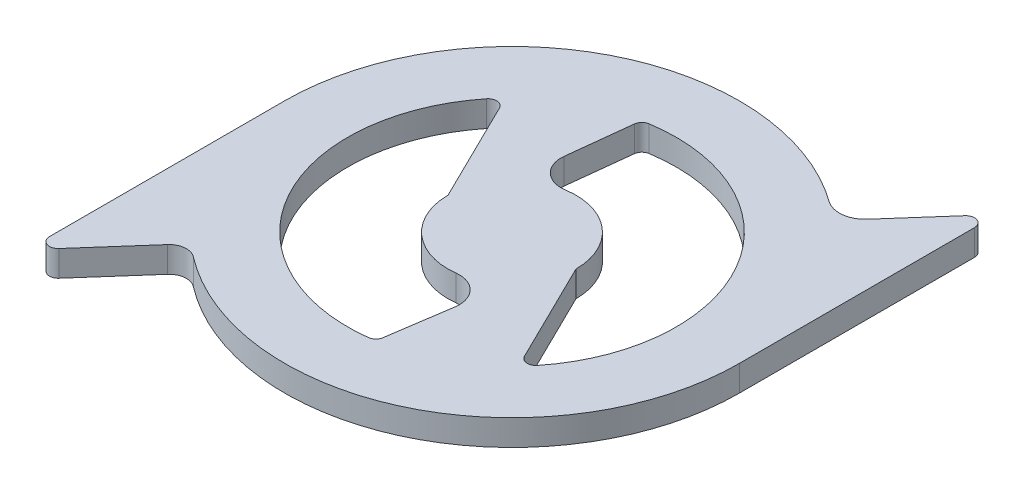
ISO-10303-21;
HEADER;
FILE_DESCRIPTION(('STEP AP214'),'2;1');
FILE_NAME('part.step','',(''),(''),'','','');
FILE_SCHEMA(('AUTOMOTIVE_DESIGN { 1 0 10303 214 1 1 1 1 }'));
ENDSEC;
DATA;
#1=APPLICATION_CONTEXT('core data for automotive mechanical design processes');
#2=APPLICATION_PROTOCOL_DEFINITION('international standard','automotive_design',2000,#1);
#3=PRODUCT_CONTEXT('',#1,'mechanical');
#4=PRODUCT('Part','Part','',(#3));
#5=PRODUCT_RELATED_PRODUCT_CATEGORY('part','',(#4));
#6=PRODUCT_DEFINITION_FORMATION('','',#4);
#7=PRODUCT_DEFINITION_CONTEXT('part definition',#1,'design');
#8=PRODUCT_DEFINITION('design','',#6,#7);
#9=PRODUCT_DEFINITION_SHAPE('','',#8);
#10=(LENGTH_UNIT() NAMED_UNIT(*) SI_UNIT(.MILLI.,.METRE.));
#11=(NAMED_UNIT(*) PLANE_ANGLE_UNIT() SI_UNIT($,.RADIAN.));
#12=(NAMED_UNIT(*) SI_UNIT($,.STERADIAN.) SOLID_ANGLE_UNIT());
#13=UNCERTAINTY_MEASURE_WITH_UNIT(LENGTH_MEASURE(1.E-05),#10,'distance_accuracy_value','');
#14=(GEOMETRIC_REPRESENTATION_CONTEXT(3) GLOBAL_UNCERTAINTY_ASSIGNED_CONTEXT((#13)) GLOBAL_UNIT_ASSIGNED_CONTEXT((#10,
#11,#12)) REPRESENTATION_CONTEXT('',''));
#15=CARTESIAN_POINT('',(0.,0.,0.));
#16=DIRECTION('',(0.,0.,1.));
#17=DIRECTION('',(1.,0.,0.));
#18=AXIS2_PLACEMENT_3D('',#15,#16,#17);
#19=CARTESIAN_POINT('',(0.,3.,0.));
#20=DIRECTION('',(0.,1.,0.));
#21=DIRECTION('',(0.,0.,1.));
#22=AXIS2_PLACEMENT_3D('',#19,#20,#21);
#23=PLANE('',#22);
#24=DIRECTION('',(0.,0.,1.));
#25=VECTOR('',#24,1.);
#26=CARTESIAN_POINT('',(-26.4575131106459,3.,0.));
#27=LINE('',#26,#25);
#28=CARTESIAN_POINT('',(-26.4575131106459,3.,0.));
#29=VERTEX_POINT('',#28);
#30=CARTESIAN_POINT('',(-26.4575131106459,3.,27.3542486889354));
#31=VERTEX_POINT('',#30);
#32=EDGE_CURVE('E288',#29,#31,#27,.T.);
#33=ORIENTED_EDGE('',*,*,#32,.T.);
#34=CARTESIAN_POINT('',(-25.4575131106459,3.,27.3542486889354));
#35=DIRECTION('',(0.,1.,0.));
#36=DIRECTION('',(0.,0.,1.));
#37=AXIS2_PLACEMENT_3D('',#34,#35,#36);
#38=CIRCLE('',#37,1.);
#39=CARTESIAN_POINT('',(-24.7075131106459,3.,28.0156865167016));
#40=VERTEX_POINT('',#39);
#41=EDGE_CURVE('E337',#31,#40,#38,.T.);
#42=ORIENTED_EDGE('',*,*,#41,.T.);
#43=DIRECTION('',(0.661437827766148,0.,-0.75));
#44=VECTOR('',#43,1.);
#45=CARTESIAN_POINT('',(-26.4575131106459,3.,30.));
#46=LINE('',#45,#44);
#47=CARTESIAN_POINT('',(-18.77633212168,3.,21.290359426251));
#48=VERTEX_POINT('',#47);
#49=EDGE_CURVE('E292',#40,#48,#46,.T.);
#50=ORIENTED_EDGE('',*,*,#49,.T.);
#51=CARTESIAN_POINT('',(-17.27633212168,3.,22.6132350817833));
#52=DIRECTION('',(0.,1.,0.));
#53=DIRECTION('',(0.,0.,1.));
#54=AXIS2_PLACEMENT_3D('',#51,#52,#53);
#55=CIRCLE('',#54,2.);
#56=CARTESIAN_POINT('',(-16.0621478706171,3.,21.0239721694648));
#57=VERTEX_POINT('',#56);
#58=EDGE_CURVE('E366',#48,#57,#55,.F.);
#59=ORIENTED_EDGE('',*,*,#58,.T.);
#60=CARTESIAN_POINT('',(0.,3.,0.));
#61=DIRECTION('',(0.,1.,0.));
#62=DIRECTION('',(0.,0.,1.));
#63=AXIS2_PLACEMENT_3D('',#60,#61,#62);
#64=CIRCLE('',#63,26.4575131106459);
#65=CARTESIAN_POINT('',(26.4575131106459,3.,0.));
#66=VERTEX_POINT('',#65);
#67=EDGE_CURVE('E295',#57,#66,#64,.T.);
#68=ORIENTED_EDGE('',*,*,#67,.T.);
#69=DIRECTION('',(0.,0.,-1.));
#70=VECTOR('',#69,1.);
#71=CARTESIAN_POINT('',(26.4575131106459,3.,0.));
#72=LINE('',#71,#70);
#73=CARTESIAN_POINT('',(26.4575131106459,3.,-27.3542486889354));
#74=VERTEX_POINT('',#73);
#75=EDGE_CURVE('E297',#66,#74,#72,.T.);
#76=ORIENTED_EDGE('',*,*,#75,.T.);
#77=CARTESIAN_POINT('',(25.4575131106459,3.,-27.3542486889354));
#78=DIRECTION('',(0.,1.,0.));
#79=DIRECTION('',(0.,0.,1.));
#80=AXIS2_PLACEMENT_3D('',#77,#78,#79);
#81=CIRCLE('',#80,1.);
#82=CARTESIAN_POINT('',(24.7075131106459,3.,-28.0156865167016));
#83=VERTEX_POINT('',#82);
#84=EDGE_CURVE('E328',#74,#83,#81,.T.);
#85=ORIENTED_EDGE('',*,*,#84,.T.);
#86=DIRECTION('',(-0.661437827766148,0.,0.75));
#87=VECTOR('',#86,1.);
#88=CARTESIAN_POINT('',(26.4575131106459,3.,-30.));
#89=LINE('',#88,#87);
#90=CARTESIAN_POINT('',(19.383007298029,3.,-21.9782644162006));
#91=VERTEX_POINT('',#90);
#92=EDGE_CURVE('E300',#83,#91,#89,.T.);
#93=ORIENTED_EDGE('',*,*,#92,.T.);
#94=CARTESIAN_POINT('',(17.133007298029,3.,-23.962577899499));
#95=DIRECTION('',(0.,1.,0.));
#96=DIRECTION('',(0.,0.,1.));
#97=AXIS2_PLACEMENT_3D('',#94,#95,#96);
#98=CIRCLE('',#97,3.);
#99=CARTESIAN_POINT('',(15.3881545773996,3.,-21.522190843454));
#100=VERTEX_POINT('',#99);
#101=EDGE_CURVE('E11',#91,#100,#98,.F.);
#102=ORIENTED_EDGE('',*,*,#101,.T.);
#103=CARTESIAN_POINT('',(0.,3.,0.));
#104=DIRECTION('',(0.,1.,0.));
#105=DIRECTION('',(0.,0.,1.));
#106=AXIS2_PLACEMENT_3D('',#103,#104,#105);
#107=CIRCLE('',#106,26.4575131106459);
#108=EDGE_CURVE('E286',#100,#29,#107,.T.);
#109=ORIENTED_EDGE('',*,*,#108,.T.);
#110=EDGE_LOOP('',(#33,#42,#50,#59,#68,#76,#85,#93,#102,#109));
#111=FACE_BOUND('',#110,.T.);
#112=CARTESIAN_POINT('',(0.,3.,0.));
#113=DIRECTION('',(0.,-1.,0.));
#114=DIRECTION('',(0.,0.,1.));
#115=AXIS2_PLACEMENT_3D('',#112,#113,#114);
#116=CIRCLE('',#115,7.44339290819635);
#117=CARTESIAN_POINT('',(-1.1563539827482,3.,-7.35302274254406));
#118=VERTEX_POINT('',#117);
#119=CARTESIAN_POINT('',(7.44339290819635,3.,0.));
#120=VERTEX_POINT('',#119);
#121=EDGE_CURVE('E249',#118,#120,#116,.T.);
#122=ORIENTED_EDGE('',*,*,#121,.F.);
#123=CARTESIAN_POINT('',(-1.62241321017722,3.,-10.3165997698083));
#124=DIRECTION('',(0.,1.,0.));
#125=DIRECTION('',(0.,0.,1.));
#126=AXIS2_PLACEMENT_3D('',#123,#124,#125);
#127=CIRCLE('',#126,3.);
#128=CARTESIAN_POINT('',(-4.60372633103575,3.,-10.6509230794903));
#129=VERTEX_POINT('',#128);
#130=EDGE_CURVE('E346',#118,#129,#127,.F.);
#131=ORIENTED_EDGE('',*,*,#130,.T.);
#132=CARTESIAN_POINT('',(-3.694798691627,3.,-18.7562445416921));
#133=CARTESIAN_POINT('',(-5.20099281668894,3.,-5.32482597899103));
#134=B_SPLINE_CURVE_WITH_KNOTS('',1,(#132,#133),.UNSPECIFIED.,.F.,.F.,(2,2),(0.,1.),.UNSPECIFIED.);
#135=CARTESIAN_POINT('',(-3.77815767201383,3.,-18.0128945724512));
#136=VERTEX_POINT('',#135);
#137=EDGE_CURVE('E245',#136,#129,#134,.T.);
#138=ORIENTED_EDGE('',*,*,#137,.F.);
#139=CARTESIAN_POINT('',(-2.78438663172765,3.,-17.9014534692239));
#140=DIRECTION('',(0.,1.,0.));
#141=DIRECTION('',(0.,0.,1.));
#142=AXIS2_PLACEMENT_3D('',#139,#140,#141);
#143=CIRCLE('',#142,1.);
#144=CARTESIAN_POINT('',(-2.93807833717175,3.,-18.8895723181877));
#145=VERTEX_POINT('',#144);
#146=EDGE_CURVE('E356',#136,#145,#143,.F.);
#147=ORIENTED_EDGE('',*,*,#146,.T.);
#148=CARTESIAN_POINT('',(0.,3.,0.));
#149=DIRECTION('',(0.,1.,0.));
#150=DIRECTION('',(0.,0.,1.));
#151=AXIS2_PLACEMENT_3D('',#148,#149,#150);
#152=CIRCLE('',#151,19.1167007268358);
#153=CARTESIAN_POINT('',(14.9092041179956,3.,11.9651109166337));
#154=VERTEX_POINT('',#153);
#155=EDGE_CURVE('E260',#154,#145,#152,.T.);
#156=ORIENTED_EDGE('',*,*,#155,.F.);
#157=CARTESIAN_POINT('',(14.1292994508128,3.,11.3392125941351));
#158=DIRECTION('',(0.,1.,0.));
#159=DIRECTION('',(0.,0.,1.));
#160=AXIS2_PLACEMENT_3D('',#157,#158,#159);
#161=CIRCLE('',#160,1.);
#162=CARTESIAN_POINT('',(13.2317942245481,3.,11.780216413651));
#163=VERTEX_POINT('',#162);
#164=EDGE_CURVE('E393',#154,#163,#161,.F.);
#165=ORIENTED_EDGE('',*,*,#164,.T.);
#166=CARTESIAN_POINT('',(7.44339290819635,3.,0.));
#167=CARTESIAN_POINT('',(13.8947790575231,3.,13.129484438546));
#168=B_SPLINE_CURVE_WITH_KNOTS('',1,(#166,#167),.UNSPECIFIED.,.F.,.F.,(2,2),(0.,1.),.UNSPECIFIED.);
#169=EDGE_CURVE('E255',#120,#163,#168,.T.);
#170=ORIENTED_EDGE('',*,*,#169,.F.);
#171=EDGE_LOOP('',(#122,#131,#138,#147,#156,#165,#170));
#172=FACE_BOUND('',#171,.T.);
#173=CARTESIAN_POINT('',(0.,3.,0.));
#174=DIRECTION('',(0.,1.,0.));
#175=DIRECTION('',(0.,0.,1.));
#176=AXIS2_PLACEMENT_3D('',#173,#174,#175);
#177=CIRCLE('',#176,19.1167007268358);
#178=CARTESIAN_POINT('',(-14.9092041179956,3.,-11.9651109166337));
#179=VERTEX_POINT('',#178);
#180=CARTESIAN_POINT('',(2.26919737076602,3.,18.9815434033145));
#181=VERTEX_POINT('',#180);
#182=EDGE_CURVE('E223',#179,#181,#177,.T.);
#183=ORIENTED_EDGE('',*,*,#182,.F.);
#184=CARTESIAN_POINT('',(-14.1292994508128,3.,-11.3392125941351));
#185=DIRECTION('',(0.,1.,0.));
#186=DIRECTION('',(0.,0.,1.));
#187=AXIS2_PLACEMENT_3D('',#184,#185,#186);
#188=CIRCLE('',#187,1.);
#189=CARTESIAN_POINT('',(-13.2317942245481,3.,-11.780216413651));
#190=VERTEX_POINT('',#189);
#191=EDGE_CURVE('E222',#179,#190,#188,.F.);
#192=ORIENTED_EDGE('',*,*,#191,.T.);
#193=CARTESIAN_POINT('',(-7.44339290819635,3.,0.));
#194=CARTESIAN_POINT('',(-13.8947790575231,3.,-13.129484438546));
#195=B_SPLINE_CURVE_WITH_KNOTS('',1,(#193,#194),.UNSPECIFIED.,.F.,.F.,(2,2),(0.,1.),.UNSPECIFIED.);
#196=CARTESIAN_POINT('',(-7.44339290819635,3.,0.));
#197=VERTEX_POINT('',#196);
#198=EDGE_CURVE('E214',#197,#190,#195,.T.);
#199=ORIENTED_EDGE('',*,*,#198,.F.);
#200=CARTESIAN_POINT('',(0.,3.,0.));
#201=DIRECTION('',(0.,-1.,0.));
#202=DIRECTION('',(0.,0.,1.));
#203=AXIS2_PLACEMENT_3D('',#200,#201,#202);
#204=CIRCLE('',#203,7.44339290819635);
#205=CARTESIAN_POINT('',(0.895975075734543,3.,7.38927104993789));
#206=VERTEX_POINT('',#205);
#207=EDGE_CURVE('E196',#206,#197,#204,.T.);
#208=ORIENTED_EDGE('',*,*,#207,.F.);
#209=CARTESIAN_POINT('',(1.25709066648131,3.,10.3674576676836));
#210=DIRECTION('',(0.,1.,0.));
#211=DIRECTION('',(0.,0.,1.));
#212=AXIS2_PLACEMENT_3D('',#209,#210,#211);
#213=CIRCLE('',#212,3.);
#214=CARTESIAN_POINT('',(4.22473836412304,3.,10.806851730777));
#215=VERTEX_POINT('',#214);
#216=EDGE_CURVE('E374',#206,#215,#213,.F.);
#217=ORIENTED_EDGE('',*,*,#216,.T.);
#218=DIRECTION('',(0.146464687697816,0.,-0.989215899213908));
#219=VECTOR('',#218,1.);
#220=CARTESIAN_POINT('',(5.00971308853062,3.,5.50516782272737));
#221=LINE('',#220,#219);
#222=CARTESIAN_POINT('',(3.13971091630545,3.,18.1350782086781));
#223=VERTEX_POINT('',#222);
#224=EDGE_CURVE('E207',#223,#215,#221,.T.);
#225=ORIENTED_EDGE('',*,*,#224,.F.);
#226=CARTESIAN_POINT('',(2.15049501709154,3.,17.9886135209803));
#227=DIRECTION('',(0.,1.,0.));
#228=DIRECTION('',(0.,0.,1.));
#229=AXIS2_PLACEMENT_3D('',#226,#227,#228);
#230=CIRCLE('',#229,1.);
#231=EDGE_CURVE('E383',#223,#181,#230,.F.);
#232=ORIENTED_EDGE('',*,*,#231,.T.);
#233=EDGE_LOOP('',(#183,#192,#199,#208,#217,#225,#232));
#234=FACE_BOUND('',#233,.T.);
#235=ADVANCED_FACE('F35',(#111,#172,#234),#23,.T.);
#236=CARTESIAN_POINT('',(0.,0.,0.));
#237=DIRECTION('',(0.,1.,0.));
#238=DIRECTION('',(0.,0.,1.));
#239=AXIS2_PLACEMENT_3D('',#236,#237,#238);
#240=PLANE('',#239);
#241=CARTESIAN_POINT('',(7.44339290819635,0.,0.));
#242=CARTESIAN_POINT('',(13.8947790575231,0.,13.129484438546));
#243=B_SPLINE_CURVE_WITH_KNOTS('',1,(#241,#242),.UNSPECIFIED.,.F.,.F.,(2,2),(0.,1.),.UNSPECIFIED.);
#244=CARTESIAN_POINT('',(7.44339290819635,0.,0.));
#245=VERTEX_POINT('',#244);
#246=CARTESIAN_POINT('',(13.2317942245481,0.,11.780216413651));
#247=VERTEX_POINT('',#246);
#248=EDGE_CURVE('E274',#245,#247,#243,.T.);
#249=ORIENTED_EDGE('',*,*,#248,.T.);
#250=CARTESIAN_POINT('',(14.1292994508128,0.,11.3392125941351));
#251=DIRECTION('',(0.,1.,0.));
#252=DIRECTION('',(0.,0.,1.));
#253=AXIS2_PLACEMENT_3D('',#250,#251,#252);
#254=CIRCLE('',#253,1.);
#255=CARTESIAN_POINT('',(14.9092041179956,0.,11.9651109166337));
#256=VERTEX_POINT('',#255);
#257=EDGE_CURVE('E391',#247,#256,#254,.T.);
#258=ORIENTED_EDGE('',*,*,#257,.T.);
#259=CARTESIAN_POINT('',(0.,0.,0.));
#260=DIRECTION('',(0.,1.,0.));
#261=DIRECTION('',(0.,0.,1.));
#262=AXIS2_PLACEMENT_3D('',#259,#260,#261);
#263=CIRCLE('',#262,19.1167007268358);
#264=CARTESIAN_POINT('',(-2.93807833717175,0.,-18.8895723181877));
#265=VERTEX_POINT('',#264);
#266=EDGE_CURVE('E250',#256,#265,#263,.T.);
#267=ORIENTED_EDGE('',*,*,#266,.T.);
#268=CARTESIAN_POINT('',(-2.78438663172765,0.,-17.9014534692239));
#269=DIRECTION('',(0.,1.,0.));
#270=DIRECTION('',(0.,0.,1.));
#271=AXIS2_PLACEMENT_3D('',#268,#269,#270);
#272=CIRCLE('',#271,1.);
#273=CARTESIAN_POINT('',(-3.77815767201383,0.,-18.0128945724512));
#274=VERTEX_POINT('',#273);
#275=EDGE_CURVE('E354',#265,#274,#272,.T.);
#276=ORIENTED_EDGE('',*,*,#275,.T.);
#277=CARTESIAN_POINT('',(-3.694798691627,0.,-18.7562445416921));
#278=CARTESIAN_POINT('',(-5.20099281668894,0.,-5.32482597899103));
#279=B_SPLINE_CURVE_WITH_KNOTS('',1,(#277,#278),.UNSPECIFIED.,.F.,.F.,(2,2),(0.,1.),.UNSPECIFIED.);
#280=CARTESIAN_POINT('',(-4.60372633103575,0.,-10.6509230794903));
#281=VERTEX_POINT('',#280);
#282=EDGE_CURVE('E218',#274,#281,#279,.T.);
#283=ORIENTED_EDGE('',*,*,#282,.T.);
#284=CARTESIAN_POINT('',(-1.62241321017722,0.,-10.3165997698083));
#285=DIRECTION('',(0.,1.,0.));
#286=DIRECTION('',(0.,0.,1.));
#287=AXIS2_PLACEMENT_3D('',#284,#285,#286);
#288=CIRCLE('',#287,3.);
#289=CARTESIAN_POINT('',(-1.1563539827482,0.,-7.35302274254406));
#290=VERTEX_POINT('',#289);
#291=EDGE_CURVE('E344',#281,#290,#288,.T.);
#292=ORIENTED_EDGE('',*,*,#291,.T.);
#293=CARTESIAN_POINT('',(0.,0.,0.));
#294=DIRECTION('',(0.,-1.,0.));
#295=DIRECTION('',(0.,0.,1.));
#296=AXIS2_PLACEMENT_3D('',#293,#294,#295);
#297=CIRCLE('',#296,7.44339290819635);
#298=EDGE_CURVE('E269',#290,#245,#297,.T.);
#299=ORIENTED_EDGE('',*,*,#298,.T.);
#300=EDGE_LOOP('',(#249,#258,#267,#276,#283,#292,#299));
#301=FACE_BOUND('',#300,.T.);
#302=DIRECTION('',(0.661437827766148,0.,-0.75));
#303=VECTOR('',#302,1.);
#304=CARTESIAN_POINT('',(-26.4575131106459,0.,30.));
#305=LINE('',#304,#303);
#306=CARTESIAN_POINT('',(-24.7075131106459,0.,28.0156865167016));
#307=VERTEX_POINT('',#306);
#308=CARTESIAN_POINT('',(-18.77633212168,0.,21.290359426251));
#309=VERTEX_POINT('',#308);
#310=EDGE_CURVE('E307',#307,#309,#305,.T.);
#311=ORIENTED_EDGE('',*,*,#310,.F.);
#312=CARTESIAN_POINT('',(-25.4575131106459,0.,27.3542486889354));
#313=DIRECTION('',(0.,1.,0.));
#314=DIRECTION('',(0.,0.,1.));
#315=AXIS2_PLACEMENT_3D('',#312,#313,#314);
#316=CIRCLE('',#315,1.);
#317=CARTESIAN_POINT('',(-26.4575131106459,0.,27.3542486889354));
#318=VERTEX_POINT('',#317);
#319=EDGE_CURVE('E333',#307,#318,#316,.F.);
#320=ORIENTED_EDGE('',*,*,#319,.T.);
#321=DIRECTION('',(0.,0.,1.));
#322=VECTOR('',#321,1.);
#323=CARTESIAN_POINT('',(-26.4575131106459,0.,0.));
#324=LINE('',#323,#322);
#325=CARTESIAN_POINT('',(-26.4575131106459,0.,0.));
#326=VERTEX_POINT('',#325);
#327=EDGE_CURVE('E304',#326,#318,#324,.T.);
#328=ORIENTED_EDGE('',*,*,#327,.F.);
#329=CARTESIAN_POINT('',(0.,0.,0.));
#330=DIRECTION('',(0.,1.,0.));
#331=DIRECTION('',(0.,0.,1.));
#332=AXIS2_PLACEMENT_3D('',#329,#330,#331);
#333=CIRCLE('',#332,26.4575131106459);
#334=CARTESIAN_POINT('',(15.3881545773996,0.,-21.522190843454));
#335=VERTEX_POINT('',#334);
#336=EDGE_CURVE('E285',#335,#326,#333,.T.);
#337=ORIENTED_EDGE('',*,*,#336,.F.);
#338=CARTESIAN_POINT('',(17.133007298029,0.,-23.962577899499));
#339=DIRECTION('',(0.,1.,0.));
#340=DIRECTION('',(0.,0.,1.));
#341=AXIS2_PLACEMENT_3D('',#338,#339,#340);
#342=CIRCLE('',#341,3.);
#343=CARTESIAN_POINT('',(19.383007298029,0.,-21.9782644162006));
#344=VERTEX_POINT('',#343);
#345=EDGE_CURVE('E43',#335,#344,#342,.T.);
#346=ORIENTED_EDGE('',*,*,#345,.T.);
#347=DIRECTION('',(-0.661437827766148,0.,0.75));
#348=VECTOR('',#347,1.);
#349=CARTESIAN_POINT('',(26.4575131106459,0.,-30.));
#350=LINE('',#349,#348);
#351=CARTESIAN_POINT('',(24.7075131106459,0.,-28.0156865167016));
#352=VERTEX_POINT('',#351);
#353=EDGE_CURVE('E289',#352,#344,#350,.T.);
#354=ORIENTED_EDGE('',*,*,#353,.F.);
#355=CARTESIAN_POINT('',(25.4575131106459,0.,-27.3542486889354));
#356=DIRECTION('',(0.,1.,0.));
#357=DIRECTION('',(0.,0.,1.));
#358=AXIS2_PLACEMENT_3D('',#355,#356,#357);
#359=CIRCLE('',#358,1.);
#360=CARTESIAN_POINT('',(26.4575131106459,0.,-27.3542486889354));
#361=VERTEX_POINT('',#360);
#362=EDGE_CURVE('E324',#352,#361,#359,.F.);
#363=ORIENTED_EDGE('',*,*,#362,.T.);
#364=DIRECTION('',(0.,0.,-1.));
#365=VECTOR('',#364,1.);
#366=CARTESIAN_POINT('',(26.4575131106459,0.,0.));
#367=LINE('',#366,#365);
#368=CARTESIAN_POINT('',(26.4575131106459,0.,0.));
#369=VERTEX_POINT('',#368);
#370=EDGE_CURVE('E312',#369,#361,#367,.T.);
#371=ORIENTED_EDGE('',*,*,#370,.F.);
#372=CARTESIAN_POINT('',(0.,0.,0.));
#373=DIRECTION('',(0.,1.,0.));
#374=DIRECTION('',(0.,0.,1.));
#375=AXIS2_PLACEMENT_3D('',#372,#373,#374);
#376=CIRCLE('',#375,26.4575131106459);
#377=CARTESIAN_POINT('',(-16.0621478706171,0.,21.0239721694648));
#378=VERTEX_POINT('',#377);
#379=EDGE_CURVE('E310',#378,#369,#376,.T.);
#380=ORIENTED_EDGE('',*,*,#379,.F.);
#381=CARTESIAN_POINT('',(-17.27633212168,0.,22.6132350817833));
#382=DIRECTION('',(0.,1.,0.));
#383=DIRECTION('',(0.,0.,1.));
#384=AXIS2_PLACEMENT_3D('',#381,#382,#383);
#385=CIRCLE('',#384,2.);
#386=EDGE_CURVE('E364',#378,#309,#385,.T.);
#387=ORIENTED_EDGE('',*,*,#386,.T.);
#388=EDGE_LOOP('',(#311,#320,#328,#337,#346,#354,#363,#371,#380,#387));
#389=FACE_BOUND('',#388,.T.);
#390=CARTESIAN_POINT('',(-7.44339290819635,0.,0.));
#391=CARTESIAN_POINT('',(-13.8947790575231,0.,-13.129484438546));
#392=B_SPLINE_CURVE_WITH_KNOTS('',1,(#390,#391),.UNSPECIFIED.,.F.,.F.,(2,2),(0.,1.),.UNSPECIFIED.);
#393=CARTESIAN_POINT('',(-7.44339290819635,0.,0.));
#394=VERTEX_POINT('',#393);
#395=CARTESIAN_POINT('',(-13.2317942245481,0.,-11.780216413651));
#396=VERTEX_POINT('',#395);
#397=EDGE_CURVE('E217',#394,#396,#392,.T.);
#398=ORIENTED_EDGE('',*,*,#397,.T.);
#399=CARTESIAN_POINT('',(-14.1292994508128,0.,-11.3392125941351));
#400=DIRECTION('',(0.,1.,0.));
#401=DIRECTION('',(0.,0.,1.));
#402=AXIS2_PLACEMENT_3D('',#399,#400,#401);
#403=CIRCLE('',#402,1.);
#404=CARTESIAN_POINT('',(-14.9092041179956,0.,-11.9651109166337));
#405=VERTEX_POINT('',#404);
#406=EDGE_CURVE('E399',#396,#405,#403,.T.);
#407=ORIENTED_EDGE('',*,*,#406,.T.);
#408=CARTESIAN_POINT('',(0.,0.,0.));
#409=DIRECTION('',(0.,1.,0.));
#410=DIRECTION('',(0.,0.,1.));
#411=AXIS2_PLACEMENT_3D('',#408,#409,#410);
#412=CIRCLE('',#411,19.1167007268358);
#413=CARTESIAN_POINT('',(2.26919737076602,0.,18.9815434033145));
#414=VERTEX_POINT('',#413);
#415=EDGE_CURVE('E239',#405,#414,#412,.T.);
#416=ORIENTED_EDGE('',*,*,#415,.T.);
#417=CARTESIAN_POINT('',(2.15049501709154,0.,17.9886135209803));
#418=DIRECTION('',(0.,1.,0.));
#419=DIRECTION('',(0.,0.,1.));
#420=AXIS2_PLACEMENT_3D('',#417,#418,#419);
#421=CIRCLE('',#420,1.);
#422=CARTESIAN_POINT('',(3.13971091630545,0.,18.1350782086781));
#423=VERTEX_POINT('',#422);
#424=EDGE_CURVE('E381',#414,#423,#421,.T.);
#425=ORIENTED_EDGE('',*,*,#424,.T.);
#426=DIRECTION('',(0.146464687697816,0.,-0.989215899213908));
#427=VECTOR('',#426,1.);
#428=CARTESIAN_POINT('',(5.00971308853062,0.,5.50516782272737));
#429=LINE('',#428,#427);
#430=CARTESIAN_POINT('',(4.22473836412304,0.,10.806851730777));
#431=VERTEX_POINT('',#430);
#432=EDGE_CURVE('E227',#423,#431,#429,.T.);
#433=ORIENTED_EDGE('',*,*,#432,.T.);
#434=CARTESIAN_POINT('',(1.25709066648131,0.,10.3674576676836));
#435=DIRECTION('',(0.,1.,0.));
#436=DIRECTION('',(0.,0.,1.));
#437=AXIS2_PLACEMENT_3D('',#434,#435,#436);
#438=CIRCLE('',#437,3.);
#439=CARTESIAN_POINT('',(0.895975075734543,0.,7.38927104993789));
#440=VERTEX_POINT('',#439);
#441=EDGE_CURVE('E372',#431,#440,#438,.T.);
#442=ORIENTED_EDGE('',*,*,#441,.T.);
#443=CARTESIAN_POINT('',(0.,0.,0.));
#444=DIRECTION('',(0.,-1.,0.));
#445=DIRECTION('',(0.,0.,1.));
#446=AXIS2_PLACEMENT_3D('',#443,#444,#445);
#447=CIRCLE('',#446,7.44339290819635);
#448=EDGE_CURVE('E224',#440,#394,#447,.T.);
#449=ORIENTED_EDGE('',*,*,#448,.T.);
#450=EDGE_LOOP('',(#398,#407,#416,#425,#433,#442,#449));
#451=FACE_BOUND('',#450,.T.);
#452=ADVANCED_FACE('F414',(#301,#389,#451),#240,.F.);
#453=CARTESIAN_POINT('',(0.,3.,0.));
#454=DIRECTION('',(0.,-1.,0.));
#455=DIRECTION('',(0.,0.,-1.));
#456=AXIS2_PLACEMENT_3D('',#453,#454,#455);
#457=CYLINDRICAL_SURFACE('',#456,26.4575131106459);
#458=ORIENTED_EDGE('',*,*,#108,.F.);
#459=DIRECTION('',(0.,-1.,0.));
#460=VECTOR('',#459,1.);
#461=CARTESIAN_POINT('',(15.3881545773996,3.,-21.522190843454));
#462=LINE('',#461,#460);
#463=EDGE_CURVE('E402',#100,#335,#462,.T.);
#464=ORIENTED_EDGE('',*,*,#463,.T.);
#465=ORIENTED_EDGE('',*,*,#336,.T.);
#466=DIRECTION('',(0.,-1.,0.));
#467=VECTOR('',#466,1.);
#468=CARTESIAN_POINT('',(-26.4575131106459,3.,0.));
#469=LINE('',#468,#467);
#470=EDGE_CURVE('E318',#29,#326,#469,.T.);
#471=ORIENTED_EDGE('',*,*,#470,.F.);
#472=EDGE_LOOP('',(#458,#464,#465,#471));
#473=FACE_BOUND('',#472,.T.);
#474=ADVANCED_FACE('F408',(#473),#457,.T.);
#475=CARTESIAN_POINT('',(-26.4575131106459,3.,0.));
#476=DIRECTION('',(1.,0.,0.));
#477=DIRECTION('',(0.,0.,-1.));
#478=AXIS2_PLACEMENT_3D('',#475,#476,#477);
#479=PLANE('',#478);
#480=ORIENTED_EDGE('',*,*,#327,.T.);
#481=DIRECTION('',(0.,-1.,0.));
#482=VECTOR('',#481,1.);
#483=CARTESIAN_POINT('',(-26.4575131106459,3.,27.3542486889354));
#484=LINE('',#483,#482);
#485=EDGE_CURVE('E335',#318,#31,#484,.F.);
#486=ORIENTED_EDGE('',*,*,#485,.T.);
#487=ORIENTED_EDGE('',*,*,#32,.F.);
#488=ORIENTED_EDGE('',*,*,#470,.T.);
#489=EDGE_LOOP('',(#480,#486,#487,#488));
#490=FACE_BOUND('',#489,.T.);
#491=ADVANCED_FACE('F419',(#490),#479,.F.);
#492=CARTESIAN_POINT('',(-26.4575131106459,3.,30.));
#493=DIRECTION('',(-0.75,0.,-0.661437827766148));
#494=DIRECTION('',(-0.661437827766148,0.,0.75));
#495=AXIS2_PLACEMENT_3D('',#492,#493,#494);
#496=PLANE('',#495);
#497=ORIENTED_EDGE('',*,*,#310,.T.);
#498=DIRECTION('',(0.,1.,0.));
#499=VECTOR('',#498,1.);
#500=CARTESIAN_POINT('',(-18.77633212168,3.,21.290359426251));
#501=LINE('',#500,#499);
#502=EDGE_CURVE('E362',#309,#48,#501,.T.);
#503=ORIENTED_EDGE('',*,*,#502,.T.);
#504=ORIENTED_EDGE('',*,*,#49,.F.);
#505=DIRECTION('',(0.,-1.,0.));
#506=VECTOR('',#505,1.);
#507=CARTESIAN_POINT('',(-24.7075131106459,3.,28.0156865167016));
#508=LINE('',#507,#506);
#509=EDGE_CURVE('E330',#40,#307,#508,.T.);
#510=ORIENTED_EDGE('',*,*,#509,.T.);
#511=EDGE_LOOP('',(#497,#503,#504,#510));
#512=FACE_BOUND('',#511,.T.);
#513=ADVANCED_FACE('F428',(#512),#496,.F.);
#514=CARTESIAN_POINT('',(0.,3.,0.));
#515=DIRECTION('',(0.,-1.,0.));
#516=DIRECTION('',(0.,0.,-1.));
#517=AXIS2_PLACEMENT_3D('',#514,#515,#516);
#518=CYLINDRICAL_SURFACE('',#517,26.4575131106459);
#519=ORIENTED_EDGE('',*,*,#67,.F.);
#520=DIRECTION('',(0.,-1.,0.));
#521=VECTOR('',#520,1.);
#522=CARTESIAN_POINT('',(-16.0621478706171,3.,21.0239721694648));
#523=LINE('',#522,#521);
#524=EDGE_CURVE('E359',#57,#378,#523,.T.);
#525=ORIENTED_EDGE('',*,*,#524,.T.);
#526=ORIENTED_EDGE('',*,*,#379,.T.);
#527=DIRECTION('',(0.,-1.,0.));
#528=VECTOR('',#527,1.);
#529=CARTESIAN_POINT('',(26.4575131106459,3.,0.));
#530=LINE('',#529,#528);
#531=EDGE_CURVE('E302',#66,#369,#530,.T.);
#532=ORIENTED_EDGE('',*,*,#531,.F.);
#533=EDGE_LOOP('',(#519,#525,#526,#532));
#534=FACE_BOUND('',#533,.T.);
#535=ADVANCED_FACE('F438',(#534),#518,.T.);
#536=CARTESIAN_POINT('',(26.4575131106459,3.,0.));
#537=DIRECTION('',(-1.,0.,0.));
#538=DIRECTION('',(0.,0.,1.));
#539=AXIS2_PLACEMENT_3D('',#536,#537,#538);
#540=PLANE('',#539);
#541=ORIENTED_EDGE('',*,*,#370,.T.);
#542=DIRECTION('',(0.,-1.,0.));
#543=VECTOR('',#542,1.);
#544=CARTESIAN_POINT('',(26.4575131106459,3.,-27.3542486889354));
#545=LINE('',#544,#543);
#546=EDGE_CURVE('E326',#361,#74,#545,.F.);
#547=ORIENTED_EDGE('',*,*,#546,.T.);
#548=ORIENTED_EDGE('',*,*,#75,.F.);
#549=ORIENTED_EDGE('',*,*,#531,.T.);
#550=EDGE_LOOP('',(#541,#547,#548,#549));
#551=FACE_BOUND('',#550,.T.);
#552=ADVANCED_FACE('F448',(#551),#540,.F.);
#553=CARTESIAN_POINT('',(26.4575131106459,3.,-30.));
#554=DIRECTION('',(0.75,0.,0.661437827766147));
#555=DIRECTION('',(0.661437827766148,0.,-0.75));
#556=AXIS2_PLACEMENT_3D('',#553,#554,#555);
#557=PLANE('',#556);
#558=ORIENTED_EDGE('',*,*,#353,.T.);
#559=DIRECTION('',(0.,1.,0.));
#560=VECTOR('',#559,1.);
#561=CARTESIAN_POINT('',(19.383007298029,3.,-21.9782644162006));
#562=LINE('',#561,#560);
#563=EDGE_CURVE('E56',#344,#91,#562,.T.);
#564=ORIENTED_EDGE('',*,*,#563,.T.);
#565=ORIENTED_EDGE('',*,*,#92,.F.);
#566=DIRECTION('',(0.,-1.,0.));
#567=VECTOR('',#566,1.);
#568=CARTESIAN_POINT('',(24.7075131106459,3.,-28.0156865167016));
#569=LINE('',#568,#567);
#570=EDGE_CURVE('E321',#83,#352,#569,.T.);
#571=ORIENTED_EDGE('',*,*,#570,.T.);
#572=EDGE_LOOP('',(#558,#564,#565,#571));
#573=FACE_BOUND('',#572,.T.);
#574=ADVANCED_FACE('F447',(#573),#557,.F.);
#575=CARTESIAN_POINT('',(-3.694798691627,3.,-18.7562445416921));
#576=DIRECTION('',(0.993771040286177,0.,0.111441103227352));
#577=DIRECTION('',(0.111441103227352,0.,-0.993771040286177));
#578=AXIS2_PLACEMENT_3D('',#575,#576,#577);
#579=PLANE('',#578);
#580=ORIENTED_EDGE('',*,*,#282,.F.);
#581=DIRECTION('',(0.,1.,0.));
#582=VECTOR('',#581,1.);
#583=CARTESIAN_POINT('',(-3.77815767201383,3.,-18.0128945724512));
#584=LINE('',#583,#582);
#585=EDGE_CURVE('E352',#274,#136,#584,.T.);
#586=ORIENTED_EDGE('',*,*,#585,.T.);
#587=ORIENTED_EDGE('',*,*,#137,.T.);
#588=DIRECTION('',(0.,1.,0.));
#589=VECTOR('',#588,1.);
#590=CARTESIAN_POINT('',(-4.60372633103575,0.,-10.6509230794903));
#591=LINE('',#590,#589);
#592=EDGE_CURVE('E339',#129,#281,#591,.F.);
#593=ORIENTED_EDGE('',*,*,#592,.T.);
#594=EDGE_LOOP('',(#580,#586,#587,#593));
#595=FACE_BOUND('',#594,.T.);
#596=ADVANCED_FACE('F455',(#595),#579,.T.);
#597=CARTESIAN_POINT('',(0.,3.,0.));
#598=DIRECTION('',(0.,-1.,0.));
#599=DIRECTION('',(0.,0.,-1.));
#600=AXIS2_PLACEMENT_3D('',#597,#598,#599);
#601=CYLINDRICAL_SURFACE('',#600,7.44339290819635);
#602=ORIENTED_EDGE('',*,*,#298,.F.);
#603=DIRECTION('',(0.,-1.,0.));
#604=VECTOR('',#603,1.);
#605=CARTESIAN_POINT('',(-1.1563539827482,3.,-7.35302274254406));
#606=LINE('',#605,#604);
#607=EDGE_CURVE('E342',#290,#118,#606,.F.);
#608=ORIENTED_EDGE('',*,*,#607,.T.);
#609=ORIENTED_EDGE('',*,*,#121,.T.);
#610=DIRECTION('',(0.,-1.,0.));
#611=VECTOR('',#610,1.);
#612=CARTESIAN_POINT('',(7.44339290819635,3.,0.));
#613=LINE('',#612,#611);
#614=EDGE_CURVE('E265',#120,#245,#613,.T.);
#615=ORIENTED_EDGE('',*,*,#614,.T.);
#616=EDGE_LOOP('',(#602,#608,#609,#615));
#617=FACE_BOUND('',#616,.T.);
#618=ADVANCED_FACE('F468',(#617),#601,.T.);
#619=CARTESIAN_POINT('',(7.44339290819635,3.,0.));
#620=DIRECTION('',(0.8975052262647,0.,-0.441003819515829));
#621=DIRECTION('',(-0.441003819515829,0.,-0.8975052262647));
#622=AXIS2_PLACEMENT_3D('',#619,#620,#621);
#623=PLANE('',#622);
#624=ORIENTED_EDGE('',*,*,#169,.T.);
#625=DIRECTION('',(0.,1.,0.));
#626=VECTOR('',#625,1.);
#627=CARTESIAN_POINT('',(13.2317942245481,0.,11.780216413651));
#628=LINE('',#627,#626);
#629=EDGE_CURVE('E386',#163,#247,#628,.F.);
#630=ORIENTED_EDGE('',*,*,#629,.T.);
#631=ORIENTED_EDGE('',*,*,#248,.F.);
#632=ORIENTED_EDGE('',*,*,#614,.F.);
#633=EDGE_LOOP('',(#624,#630,#631,#632));
#634=FACE_BOUND('',#633,.T.);
#635=ADVANCED_FACE('F472',(#634),#623,.T.);
#636=CARTESIAN_POINT('',(0.,3.,0.));
#637=DIRECTION('',(0.,-1.,0.));
#638=DIRECTION('',(0.,0.,-1.));
#639=AXIS2_PLACEMENT_3D('',#636,#637,#638);
#640=CYLINDRICAL_SURFACE('',#639,19.1167007268358);
#641=ORIENTED_EDGE('',*,*,#266,.F.);
#642=DIRECTION('',(0.,-1.,0.));
#643=VECTOR('',#642,1.);
#644=CARTESIAN_POINT('',(14.9092041179956,3.,11.9651109166337));
#645=LINE('',#644,#643);
#646=EDGE_CURVE('E389',#256,#154,#645,.F.);
#647=ORIENTED_EDGE('',*,*,#646,.T.);
#648=ORIENTED_EDGE('',*,*,#155,.T.);
#649=DIRECTION('',(0.,-1.,0.));
#650=VECTOR('',#649,1.);
#651=CARTESIAN_POINT('',(-2.93807833717175,3.,-18.8895723181877));
#652=LINE('',#651,#650);
#653=EDGE_CURVE('E349',#145,#265,#652,.T.);
#654=ORIENTED_EDGE('',*,*,#653,.T.);
#655=EDGE_LOOP('',(#641,#647,#648,#654));
#656=FACE_BOUND('',#655,.T.);
#657=ADVANCED_FACE('F476',(#656),#640,.F.);
#658=CARTESIAN_POINT('',(-7.44339290819635,3.,0.));
#659=DIRECTION('',(-0.8975052262647,0.,0.441003819515829));
#660=DIRECTION('',(0.441003819515829,0.,0.8975052262647));
#661=AXIS2_PLACEMENT_3D('',#658,#659,#660);
#662=PLANE('',#661);
#663=ORIENTED_EDGE('',*,*,#198,.T.);
#664=DIRECTION('',(0.,1.,0.));
#665=VECTOR('',#664,1.);
#666=CARTESIAN_POINT('',(-13.2317942245481,0.,-11.780216413651));
#667=LINE('',#666,#665);
#668=EDGE_CURVE('E395',#190,#396,#667,.F.);
#669=ORIENTED_EDGE('',*,*,#668,.T.);
#670=ORIENTED_EDGE('',*,*,#397,.F.);
#671=DIRECTION('',(0.,-1.,0.));
#672=VECTOR('',#671,1.);
#673=CARTESIAN_POINT('',(-7.44339290819635,3.,0.));
#674=LINE('',#673,#672);
#675=EDGE_CURVE('E200',#197,#394,#674,.T.);
#676=ORIENTED_EDGE('',*,*,#675,.F.);
#677=EDGE_LOOP('',(#663,#669,#670,#676));
#678=FACE_BOUND('',#677,.T.);
#679=ADVANCED_FACE('F212',(#678),#662,.T.);
#680=CARTESIAN_POINT('',(0.,3.,0.));
#681=DIRECTION('',(0.,-1.,0.));
#682=DIRECTION('',(0.,0.,-1.));
#683=AXIS2_PLACEMENT_3D('',#680,#681,#682);
#684=CYLINDRICAL_SURFACE('',#683,19.1167007268358);
#685=ORIENTED_EDGE('',*,*,#415,.F.);
#686=DIRECTION('',(0.,-1.,0.));
#687=VECTOR('',#686,1.);
#688=CARTESIAN_POINT('',(-14.9092041179956,3.,-11.9651109166337));
#689=LINE('',#688,#687);
#690=EDGE_CURVE('E397',#405,#179,#689,.F.);
#691=ORIENTED_EDGE('',*,*,#690,.T.);
#692=ORIENTED_EDGE('',*,*,#182,.T.);
#693=DIRECTION('',(0.,-1.,0.));
#694=VECTOR('',#693,1.);
#695=CARTESIAN_POINT('',(2.26919737076602,3.,18.9815434033145));
#696=LINE('',#695,#694);
#697=EDGE_CURVE('E376',#181,#414,#696,.T.);
#698=ORIENTED_EDGE('',*,*,#697,.T.);
#699=EDGE_LOOP('',(#685,#691,#692,#698));
#700=FACE_BOUND('',#699,.T.);
#701=ADVANCED_FACE('F483',(#700),#684,.F.);
#702=CARTESIAN_POINT('',(5.00971308853062,3.,5.50516782272737));
#703=DIRECTION('',(-0.989215899213908,0.,-0.146464687697816));
#704=DIRECTION('',(-0.146464687697816,0.,0.989215899213908));
#705=AXIS2_PLACEMENT_3D('',#702,#703,#704);
#706=PLANE('',#705);
#707=ORIENTED_EDGE('',*,*,#432,.F.);
#708=DIRECTION('',(0.,1.,0.));
#709=VECTOR('',#708,1.);
#710=CARTESIAN_POINT('',(3.13971091630545,3.,18.1350782086781));
#711=LINE('',#710,#709);
#712=EDGE_CURVE('E379',#423,#223,#711,.T.);
#713=ORIENTED_EDGE('',*,*,#712,.T.);
#714=ORIENTED_EDGE('',*,*,#224,.T.);
#715=DIRECTION('',(0.,1.,0.));
#716=VECTOR('',#715,1.);
#717=CARTESIAN_POINT('',(4.22473836412304,0.,10.806851730777));
#718=LINE('',#717,#716);
#719=EDGE_CURVE('E368',#215,#431,#718,.F.);
#720=ORIENTED_EDGE('',*,*,#719,.T.);
#721=EDGE_LOOP('',(#707,#713,#714,#720));
#722=FACE_BOUND('',#721,.T.);
#723=ADVANCED_FACE('F486',(#722),#706,.T.);
#724=CARTESIAN_POINT('',(0.,3.,0.));
#725=DIRECTION('',(0.,-1.,0.));
#726=DIRECTION('',(0.,0.,-1.));
#727=AXIS2_PLACEMENT_3D('',#724,#725,#726);
#728=CYLINDRICAL_SURFACE('',#727,7.44339290819635);
#729=ORIENTED_EDGE('',*,*,#448,.F.);
#730=DIRECTION('',(0.,-1.,0.));
#731=VECTOR('',#730,1.);
#732=CARTESIAN_POINT('',(0.895975075734543,3.,7.3892710499379));
#733=LINE('',#732,#731);
#734=EDGE_CURVE('E202',#440,#206,#733,.F.);
#735=ORIENTED_EDGE('',*,*,#734,.T.);
#736=ORIENTED_EDGE('',*,*,#207,.T.);
#737=ORIENTED_EDGE('',*,*,#675,.T.);
#738=EDGE_LOOP('',(#729,#735,#736,#737));
#739=FACE_BOUND('',#738,.T.);
#740=ADVANCED_FACE('F199',(#739),#728,.T.);
#741=CARTESIAN_POINT('',(25.4575131106459,3.,-27.3542486889354));
#742=DIRECTION('',(0.,-1.,0.));
#743=DIRECTION('',(0.,0.,-1.));
#744=AXIS2_PLACEMENT_3D('',#741,#742,#743);
#745=CYLINDRICAL_SURFACE('',#744,1.);
#746=ORIENTED_EDGE('',*,*,#84,.F.);
#747=ORIENTED_EDGE('',*,*,#546,.F.);
#748=ORIENTED_EDGE('',*,*,#362,.F.);
#749=ORIENTED_EDGE('',*,*,#570,.F.);
#750=EDGE_LOOP('',(#746,#747,#748,#749));
#751=FACE_BOUND('',#750,.T.);
#752=ADVANCED_FACE('F446',(#751),#745,.T.);
#753=CARTESIAN_POINT('',(-25.4575131106459,3.,27.3542486889354));
#754=DIRECTION('',(0.,-1.,0.));
#755=DIRECTION('',(0.,0.,-1.));
#756=AXIS2_PLACEMENT_3D('',#753,#754,#755);
#757=CYLINDRICAL_SURFACE('',#756,1.);
#758=ORIENTED_EDGE('',*,*,#41,.F.);
#759=ORIENTED_EDGE('',*,*,#485,.F.);
#760=ORIENTED_EDGE('',*,*,#319,.F.);
#761=ORIENTED_EDGE('',*,*,#509,.F.);
#762=EDGE_LOOP('',(#758,#759,#760,#761));
#763=FACE_BOUND('',#762,.T.);
#764=ADVANCED_FACE('F426',(#763),#757,.T.);
#765=CARTESIAN_POINT('',(-1.62241321017722,3.,-10.3165997698083));
#766=DIRECTION('',(0.,-1.,0.));
#767=DIRECTION('',(0.,0.,-1.));
#768=AXIS2_PLACEMENT_3D('',#765,#766,#767);
#769=CYLINDRICAL_SURFACE('',#768,3.);
#770=ORIENTED_EDGE('',*,*,#130,.F.);
#771=ORIENTED_EDGE('',*,*,#607,.F.);
#772=ORIENTED_EDGE('',*,*,#291,.F.);
#773=ORIENTED_EDGE('',*,*,#592,.F.);
#774=EDGE_LOOP('',(#770,#771,#772,#773));
#775=FACE_BOUND('',#774,.T.);
#776=ADVANCED_FACE('F499',(#775),#769,.F.);
#777=CARTESIAN_POINT('',(-2.78438663172765,3.,-17.9014534692239));
#778=DIRECTION('',(0.,-1.,0.));
#779=DIRECTION('',(0.,0.,-1.));
#780=AXIS2_PLACEMENT_3D('',#777,#778,#779);
#781=CYLINDRICAL_SURFACE('',#780,1.);
#782=ORIENTED_EDGE('',*,*,#146,.F.);
#783=ORIENTED_EDGE('',*,*,#585,.F.);
#784=ORIENTED_EDGE('',*,*,#275,.F.);
#785=ORIENTED_EDGE('',*,*,#653,.F.);
#786=EDGE_LOOP('',(#782,#783,#784,#785));
#787=FACE_BOUND('',#786,.T.);
#788=ADVANCED_FACE('F506',(#787),#781,.F.);
#789=CARTESIAN_POINT('',(-17.27633212168,3.,22.6132350817833));
#790=DIRECTION('',(0.,-1.,0.));
#791=DIRECTION('',(0.,0.,-1.));
#792=AXIS2_PLACEMENT_3D('',#789,#790,#791);
#793=CYLINDRICAL_SURFACE('',#792,2.);
#794=ORIENTED_EDGE('',*,*,#58,.F.);
#795=ORIENTED_EDGE('',*,*,#502,.F.);
#796=ORIENTED_EDGE('',*,*,#386,.F.);
#797=ORIENTED_EDGE('',*,*,#524,.F.);
#798=EDGE_LOOP('',(#794,#795,#796,#797));
#799=FACE_BOUND('',#798,.T.);
#800=ADVANCED_FACE('F435',(#799),#793,.F.);
#801=CARTESIAN_POINT('',(1.25709066648131,3.,10.3674576676836));
#802=DIRECTION('',(0.,-1.,0.));
#803=DIRECTION('',(0.,0.,-1.));
#804=AXIS2_PLACEMENT_3D('',#801,#802,#803);
#805=CYLINDRICAL_SURFACE('',#804,3.);
#806=ORIENTED_EDGE('',*,*,#216,.F.);
#807=ORIENTED_EDGE('',*,*,#734,.F.);
#808=ORIENTED_EDGE('',*,*,#441,.F.);
#809=ORIENTED_EDGE('',*,*,#719,.F.);
#810=EDGE_LOOP('',(#806,#807,#808,#809));
#811=FACE_BOUND('',#810,.T.);
#812=ADVANCED_FACE('F513',(#811),#805,.F.);
#813=CARTESIAN_POINT('',(2.15049501709154,3.,17.9886135209803));
#814=DIRECTION('',(0.,-1.,0.));
#815=DIRECTION('',(0.,0.,-1.));
#816=AXIS2_PLACEMENT_3D('',#813,#814,#815);
#817=CYLINDRICAL_SURFACE('',#816,1.);
#818=ORIENTED_EDGE('',*,*,#231,.F.);
#819=ORIENTED_EDGE('',*,*,#712,.F.);
#820=ORIENTED_EDGE('',*,*,#424,.F.);
#821=ORIENTED_EDGE('',*,*,#697,.F.);
#822=EDGE_LOOP('',(#818,#819,#820,#821));
#823=FACE_BOUND('',#822,.T.);
#824=ADVANCED_FACE('F516',(#823),#817,.F.);
#825=CARTESIAN_POINT('',(14.1292994508128,3.,11.3392125941351));
#826=DIRECTION('',(0.,-1.,0.));
#827=DIRECTION('',(0.,0.,-1.));
#828=AXIS2_PLACEMENT_3D('',#825,#826,#827);
#829=CYLINDRICAL_SURFACE('',#828,1.);
#830=ORIENTED_EDGE('',*,*,#164,.F.);
#831=ORIENTED_EDGE('',*,*,#646,.F.);
#832=ORIENTED_EDGE('',*,*,#257,.F.);
#833=ORIENTED_EDGE('',*,*,#629,.F.);
#834=EDGE_LOOP('',(#830,#831,#832,#833));
#835=FACE_BOUND('',#834,.T.);
#836=ADVANCED_FACE('F520',(#835),#829,.F.);
#837=CARTESIAN_POINT('',(-14.1292994508128,3.,-11.3392125941351));
#838=DIRECTION('',(0.,-1.,0.));
#839=DIRECTION('',(0.,0.,-1.));
#840=AXIS2_PLACEMENT_3D('',#837,#838,#839);
#841=CYLINDRICAL_SURFACE('',#840,1.);
#842=ORIENTED_EDGE('',*,*,#191,.F.);
#843=ORIENTED_EDGE('',*,*,#690,.F.);
#844=ORIENTED_EDGE('',*,*,#406,.F.);
#845=ORIENTED_EDGE('',*,*,#668,.F.);
#846=EDGE_LOOP('',(#842,#843,#844,#845));
#847=FACE_BOUND('',#846,.T.);
#848=ADVANCED_FACE('F523',(#847),#841,.F.);
#849=CARTESIAN_POINT('',(17.133007298029,3.,-23.962577899499));
#850=DIRECTION('',(0.,-1.,0.));
#851=DIRECTION('',(0.,0.,-1.));
#852=AXIS2_PLACEMENT_3D('',#849,#850,#851);
#853=CYLINDRICAL_SURFACE('',#852,3.);
#854=ORIENTED_EDGE('',*,*,#101,.F.);
#855=ORIENTED_EDGE('',*,*,#563,.F.);
#856=ORIENTED_EDGE('',*,*,#345,.F.);
#857=ORIENTED_EDGE('',*,*,#463,.F.);
#858=EDGE_LOOP('',(#854,#855,#856,#857));
#859=FACE_BOUND('',#858,.T.);
#860=ADVANCED_FACE('F37',(#859),#853,.F.);
#861=CLOSED_SHELL('',(#235,#452,#474,#491,#513,#535,#552,#574,#596,#618,#635,#657,#679,#701,
#723,#740,#752,#764,#776,#788,#800,#812,#824,#836,#848,#860));
#862=MANIFOLD_SOLID_BREP('B2',#861);
#863=ADVANCED_BREP_SHAPE_REPRESENTATION('',(#18,#862),#14);
#864=SHAPE_DEFINITION_REPRESENTATION(#9,#863);
ENDSEC;
END-ISO-10303-21;
